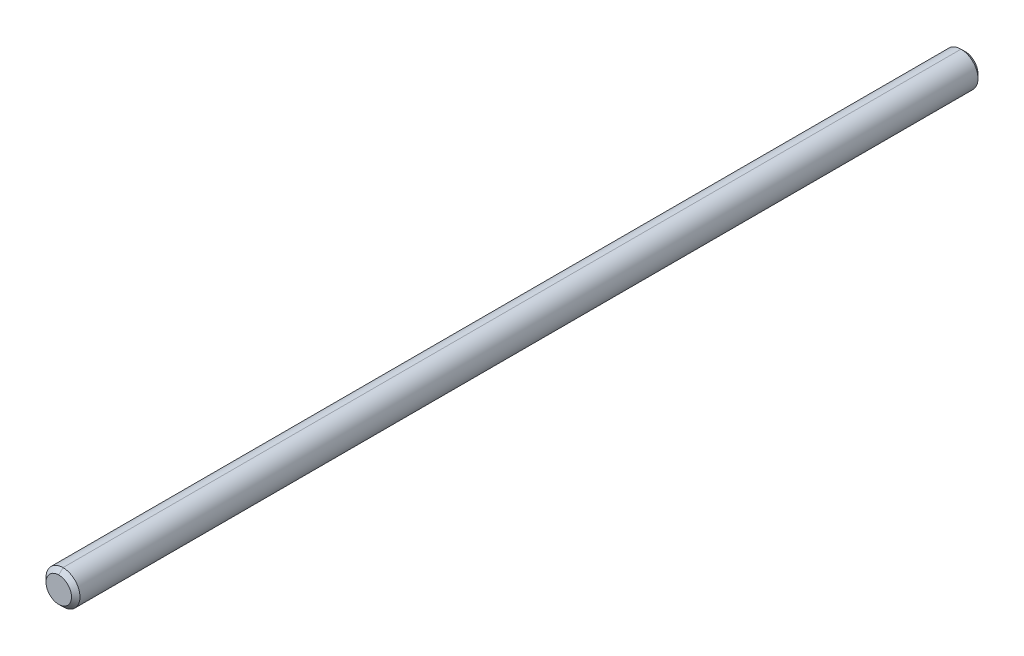
ISO-10303-21;
HEADER;
FILE_DESCRIPTION(('STEP AP214'),'2;1');
FILE_NAME('part.step','',(''),(''),'','','');
FILE_SCHEMA(('AUTOMOTIVE_DESIGN { 1 0 10303 214 1 1 1 1 }'));
ENDSEC;
DATA;
#1=APPLICATION_CONTEXT('core data for automotive mechanical design processes');
#2=APPLICATION_PROTOCOL_DEFINITION('international standard','automotive_design',2000,#1);
#3=PRODUCT_CONTEXT('',#1,'mechanical');
#4=PRODUCT('Part','Part','',(#3));
#5=PRODUCT_RELATED_PRODUCT_CATEGORY('part','',(#4));
#6=PRODUCT_DEFINITION_FORMATION('','',#4);
#7=PRODUCT_DEFINITION_CONTEXT('part definition',#1,'design');
#8=PRODUCT_DEFINITION('design','',#6,#7);
#9=PRODUCT_DEFINITION_SHAPE('','',#8);
#10=(LENGTH_UNIT() NAMED_UNIT(*) SI_UNIT(.MILLI.,.METRE.));
#11=(NAMED_UNIT(*) PLANE_ANGLE_UNIT() SI_UNIT($,.RADIAN.));
#12=(NAMED_UNIT(*) SI_UNIT($,.STERADIAN.) SOLID_ANGLE_UNIT());
#13=UNCERTAINTY_MEASURE_WITH_UNIT(LENGTH_MEASURE(1.E-05),#10,'distance_accuracy_value','');
#14=(GEOMETRIC_REPRESENTATION_CONTEXT(3) GLOBAL_UNCERTAINTY_ASSIGNED_CONTEXT((#13)) GLOBAL_UNIT_ASSIGNED_CONTEXT((#10,
#11,#12)) REPRESENTATION_CONTEXT('',''));
#15=CARTESIAN_POINT('',(0.,0.,0.));
#16=DIRECTION('',(0.,0.,1.));
#17=DIRECTION('',(1.,0.,0.));
#18=AXIS2_PLACEMENT_3D('',#15,#16,#17);
#19=CARTESIAN_POINT('',(0.,0.,127.));
#20=DIRECTION('',(0.,0.,-1.));
#21=DIRECTION('',(0.,1.,0.));
#22=AXIS2_PLACEMENT_3D('',#19,#20,#21);
#23=CONICAL_SURFACE('',#22,3.571875,0.785398163397446);
#24=DIRECTION('',(0.,-0.707106781186546,-0.707106781186549));
#25=VECTOR('',#24,1.);
#26=CARTESIAN_POINT('',(0.,-3.571875,127.));
#27=LINE('',#26,#25);
#28=CARTESIAN_POINT('',(0.,-3.571875,127.));
#29=VERTEX_POINT('',#28);
#30=CARTESIAN_POINT('',(0.,-4.76249999999994,125.809375));
#31=VERTEX_POINT('',#30);
#32=EDGE_CURVE('E85',#29,#31,#27,.T.);
#33=ORIENTED_EDGE('',*,*,#32,.F.);
#34=CARTESIAN_POINT('',(0.,0.,127.));
#35=DIRECTION('',(0.,0.,1.));
#36=DIRECTION('',(0.,1.,0.));
#37=AXIS2_PLACEMENT_3D('',#34,#35,#36);
#38=CIRCLE('',#37,3.571875);
#39=CARTESIAN_POINT('',(0.,3.571875,127.));
#40=VERTEX_POINT('',#39);
#41=EDGE_CURVE('E72',#40,#29,#38,.T.);
#42=ORIENTED_EDGE('',*,*,#41,.F.);
#43=DIRECTION('',(0.,0.707106781186546,-0.707106781186549));
#44=VECTOR('',#43,1.);
#45=CARTESIAN_POINT('',(0.,3.571875,127.));
#46=LINE('',#45,#44);
#47=CARTESIAN_POINT('',(0.,4.76249999999994,125.809375));
#48=VERTEX_POINT('',#47);
#49=EDGE_CURVE('E92',#40,#48,#46,.T.);
#50=ORIENTED_EDGE('',*,*,#49,.T.);
#51=CARTESIAN_POINT('',(0.,0.,125.809375));
#52=DIRECTION('',(0.,0.,-1.));
#53=DIRECTION('',(0.,1.,0.));
#54=AXIS2_PLACEMENT_3D('',#51,#52,#53);
#55=CIRCLE('',#54,4.76249999999994);
#56=EDGE_CURVE('E10',#31,#48,#55,.T.);
#57=ORIENTED_EDGE('',*,*,#56,.F.);
#58=EDGE_LOOP('',(#33,#42,#50,#57));
#59=FACE_BOUND('',#58,.T.);
#60=ADVANCED_FACE('F16',(#59),#23,.T.);
#61=CARTESIAN_POINT('',(0.,0.,-125.809375));
#62=DIRECTION('',(0.,0.,1.));
#63=DIRECTION('',(0.,-1.,0.));
#64=AXIS2_PLACEMENT_3D('',#61,#62,#63);
#65=CONICAL_SURFACE('',#64,4.76249999999994,0.785398163397457);
#66=DIRECTION('',(0.,0.707106781186554,0.707106781186541));
#67=VECTOR('',#66,1.);
#68=CARTESIAN_POINT('',(0.,4.7625,-125.809375));
#69=LINE('',#68,#67);
#70=CARTESIAN_POINT('',(0.,3.571875,-127.));
#71=VERTEX_POINT('',#70);
#72=CARTESIAN_POINT('',(0.,4.7625,-125.809375));
#73=VERTEX_POINT('',#72);
#74=EDGE_CURVE('E107',#71,#73,#69,.T.);
#75=ORIENTED_EDGE('',*,*,#74,.F.);
#76=CARTESIAN_POINT('',(0.,0.,-127.));
#77=DIRECTION('',(0.,0.,-1.));
#78=DIRECTION('',(0.,-1.,0.));
#79=AXIS2_PLACEMENT_3D('',#76,#77,#78);
#80=CIRCLE('',#79,3.57187499999992);
#81=CARTESIAN_POINT('',(0.,-3.57187499999987,-127.));
#82=VERTEX_POINT('',#81);
#83=EDGE_CURVE('E81',#82,#71,#80,.T.);
#84=ORIENTED_EDGE('',*,*,#83,.F.);
#85=DIRECTION('',(0.,-0.707106781186554,0.707106781186541));
#86=VECTOR('',#85,1.);
#87=CARTESIAN_POINT('',(0.,-4.76249999999989,-125.809375));
#88=LINE('',#87,#86);
#89=CARTESIAN_POINT('',(0.,-4.76249999999989,-125.809375));
#90=VERTEX_POINT('',#89);
#91=EDGE_CURVE('E115',#82,#90,#88,.T.);
#92=ORIENTED_EDGE('',*,*,#91,.T.);
#93=CARTESIAN_POINT('',(0.,0.,-125.809375));
#94=DIRECTION('',(0.,0.,1.));
#95=DIRECTION('',(0.,-1.,0.));
#96=AXIS2_PLACEMENT_3D('',#93,#94,#95);
#97=CIRCLE('',#96,4.76249999999994);
#98=EDGE_CURVE('E25',#73,#90,#97,.T.);
#99=ORIENTED_EDGE('',*,*,#98,.F.);
#100=EDGE_LOOP('',(#75,#84,#92,#99));
#101=FACE_BOUND('',#100,.T.);
#102=ADVANCED_FACE('F18',(#101),#65,.T.);
#103=CARTESIAN_POINT('',(0.,0.,127.));
#104=DIRECTION('',(0.,0.,1.));
#105=DIRECTION('',(0.,-1.,0.));
#106=AXIS2_PLACEMENT_3D('',#103,#104,#105);
#107=CYLINDRICAL_SURFACE('',#106,4.76249999999994);
#108=DIRECTION('',(0.,0.,1.));
#109=VECTOR('',#108,1.);
#110=CARTESIAN_POINT('',(0.,4.76249999999994,127.));
#111=LINE('',#110,#109);
#112=EDGE_CURVE('E120',#73,#48,#111,.T.);
#113=ORIENTED_EDGE('',*,*,#112,.F.);
#114=ORIENTED_EDGE('',*,*,#98,.T.);
#115=DIRECTION('',(0.,0.,1.));
#116=VECTOR('',#115,1.);
#117=CARTESIAN_POINT('',(0.,-4.76249999999994,127.));
#118=LINE('',#117,#116);
#119=EDGE_CURVE('E82',#90,#31,#118,.T.);
#120=ORIENTED_EDGE('',*,*,#119,.T.);
#121=ORIENTED_EDGE('',*,*,#56,.T.);
#122=EDGE_LOOP('',(#113,#114,#120,#121));
#123=FACE_BOUND('',#122,.T.);
#124=ADVANCED_FACE('F137',(#123),#107,.T.);
#125=CARTESIAN_POINT('',(0.,4.7625,-127.));
#126=DIRECTION('',(0.,0.,1.));
#127=DIRECTION('',(0.,-1.,0.));
#128=AXIS2_PLACEMENT_3D('',#125,#126,#127);
#129=PLANE('',#128);
#130=ORIENTED_EDGE('',*,*,#83,.T.);
#131=CARTESIAN_POINT('',(0.,0.,-127.));
#132=DIRECTION('',(0.,0.,-1.));
#133=DIRECTION('',(0.,-1.,0.));
#134=AXIS2_PLACEMENT_3D('',#131,#132,#133);
#135=CIRCLE('',#134,3.57187499999992);
#136=EDGE_CURVE('E103',#71,#82,#135,.T.);
#137=ORIENTED_EDGE('',*,*,#136,.T.);
#138=EDGE_LOOP('',(#130,#137));
#139=FACE_BOUND('',#138,.T.);
#140=ADVANCED_FACE('F129',(#139),#129,.F.);
#141=CARTESIAN_POINT('',(0.,4.7625,127.));
#142=DIRECTION('',(0.,0.,-1.));
#143=DIRECTION('',(-1.,0.,0.));
#144=AXIS2_PLACEMENT_3D('',#141,#142,#143);
#145=PLANE('',#144);
#146=ORIENTED_EDGE('',*,*,#41,.T.);
#147=CARTESIAN_POINT('',(0.,0.,127.));
#148=DIRECTION('',(0.,0.,1.));
#149=DIRECTION('',(0.,1.,0.));
#150=AXIS2_PLACEMENT_3D('',#147,#148,#149);
#151=CIRCLE('',#150,3.571875);
#152=EDGE_CURVE('E76',#29,#40,#151,.T.);
#153=ORIENTED_EDGE('',*,*,#152,.T.);
#154=EDGE_LOOP('',(#146,#153));
#155=FACE_BOUND('',#154,.T.);
#156=ADVANCED_FACE('F74',(#155),#145,.F.);
#157=CARTESIAN_POINT('',(0.,0.,127.));
#158=DIRECTION('',(0.,0.,1.));
#159=DIRECTION('',(0.,-1.,0.));
#160=AXIS2_PLACEMENT_3D('',#157,#158,#159);
#161=CYLINDRICAL_SURFACE('',#160,4.76249999999994);
#162=CARTESIAN_POINT('',(0.,0.,-125.809375));
#163=DIRECTION('',(0.,0.,1.));
#164=DIRECTION('',(0.,-1.,0.));
#165=AXIS2_PLACEMENT_3D('',#162,#163,#164);
#166=CIRCLE('',#165,4.76249999999994);
#167=EDGE_CURVE('E111',#90,#73,#166,.T.);
#168=ORIENTED_EDGE('',*,*,#167,.T.);
#169=ORIENTED_EDGE('',*,*,#112,.T.);
#170=CARTESIAN_POINT('',(0.,0.,125.809375));
#171=DIRECTION('',(0.,0.,-1.));
#172=DIRECTION('',(0.,1.,0.));
#173=AXIS2_PLACEMENT_3D('',#170,#171,#172);
#174=CIRCLE('',#173,4.76249999999994);
#175=EDGE_CURVE('E89',#48,#31,#174,.T.);
#176=ORIENTED_EDGE('',*,*,#175,.T.);
#177=ORIENTED_EDGE('',*,*,#119,.F.);
#178=EDGE_LOOP('',(#168,#169,#176,#177));
#179=FACE_BOUND('',#178,.T.);
#180=ADVANCED_FACE('F136',(#179),#161,.T.);
#181=CARTESIAN_POINT('',(0.,0.,-125.809375));
#182=DIRECTION('',(0.,0.,1.));
#183=DIRECTION('',(0.,-1.,0.));
#184=AXIS2_PLACEMENT_3D('',#181,#182,#183);
#185=CONICAL_SURFACE('',#184,4.76249999999994,0.785398163397457);
#186=ORIENTED_EDGE('',*,*,#136,.F.);
#187=ORIENTED_EDGE('',*,*,#74,.T.);
#188=ORIENTED_EDGE('',*,*,#167,.F.);
#189=ORIENTED_EDGE('',*,*,#91,.F.);
#190=EDGE_LOOP('',(#186,#187,#188,#189));
#191=FACE_BOUND('',#190,.T.);
#192=ADVANCED_FACE('F134',(#191),#185,.T.);
#193=CARTESIAN_POINT('',(0.,0.,127.));
#194=DIRECTION('',(0.,0.,-1.));
#195=DIRECTION('',(0.,1.,0.));
#196=AXIS2_PLACEMENT_3D('',#193,#194,#195);
#197=CONICAL_SURFACE('',#196,3.571875,0.785398163397446);
#198=ORIENTED_EDGE('',*,*,#152,.F.);
#199=ORIENTED_EDGE('',*,*,#32,.T.);
#200=ORIENTED_EDGE('',*,*,#175,.F.);
#201=ORIENTED_EDGE('',*,*,#49,.F.);
#202=EDGE_LOOP('',(#198,#199,#200,#201));
#203=FACE_BOUND('',#202,.T.);
#204=ADVANCED_FACE('F91',(#203),#197,.T.);
#205=CLOSED_SHELL('',(#60,#102,#124,#140,#156,#180,#192,#204));
#206=MANIFOLD_SOLID_BREP('B1',#205);
#207=ADVANCED_BREP_SHAPE_REPRESENTATION('',(#18,#206),#14);
#208=SHAPE_DEFINITION_REPRESENTATION(#9,#207);
ENDSEC;
END-ISO-10303-21;
